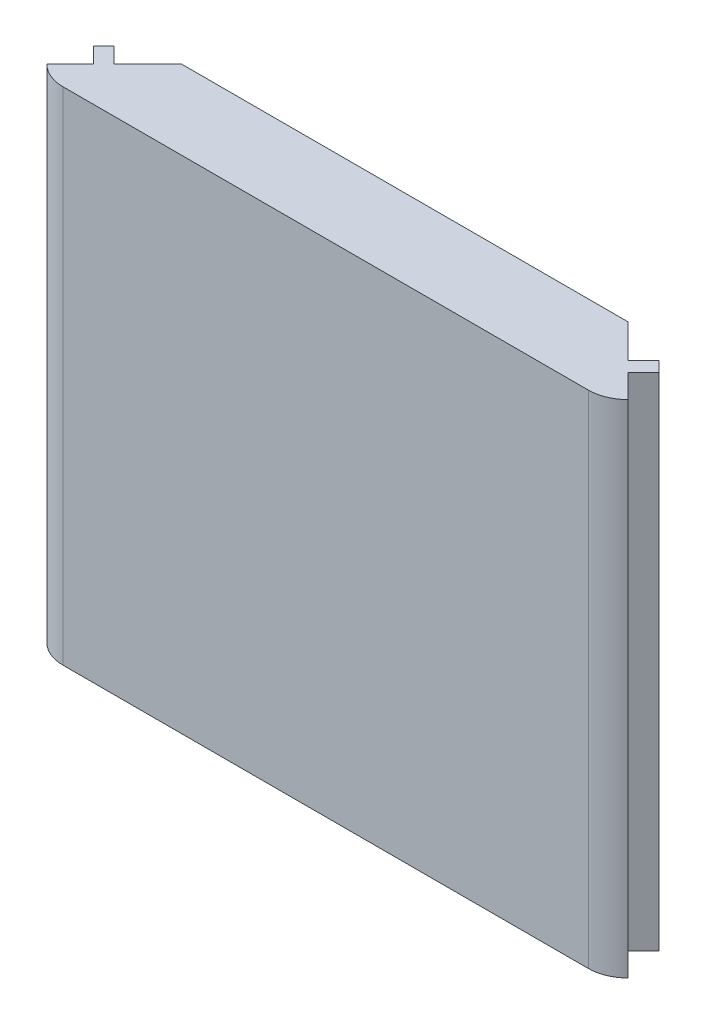
ISO-10303-21;
HEADER;
FILE_DESCRIPTION(('STEP AP214'),'2;1');
FILE_NAME('part.step','',(''),(''),'','','');
FILE_SCHEMA(('AUTOMOTIVE_DESIGN { 1 0 10303 214 1 1 1 1 }'));
ENDSEC;
DATA;
#1=APPLICATION_CONTEXT('core data for automotive mechanical design processes');
#2=APPLICATION_PROTOCOL_DEFINITION('international standard','automotive_design',2000,#1);
#3=PRODUCT_CONTEXT('',#1,'mechanical');
#4=PRODUCT('Part','Part','',(#3));
#5=PRODUCT_RELATED_PRODUCT_CATEGORY('part','',(#4));
#6=PRODUCT_DEFINITION_FORMATION('','',#4);
#7=PRODUCT_DEFINITION_CONTEXT('part definition',#1,'design');
#8=PRODUCT_DEFINITION('design','',#6,#7);
#9=PRODUCT_DEFINITION_SHAPE('','',#8);
#10=(LENGTH_UNIT() NAMED_UNIT(*) SI_UNIT(.MILLI.,.METRE.));
#11=(NAMED_UNIT(*) PLANE_ANGLE_UNIT() SI_UNIT($,.RADIAN.));
#12=(NAMED_UNIT(*) SI_UNIT($,.STERADIAN.) SOLID_ANGLE_UNIT());
#13=UNCERTAINTY_MEASURE_WITH_UNIT(LENGTH_MEASURE(1.E-05),#10,'distance_accuracy_value','');
#14=(GEOMETRIC_REPRESENTATION_CONTEXT(3) GLOBAL_UNCERTAINTY_ASSIGNED_CONTEXT((#13)) GLOBAL_UNIT_ASSIGNED_CONTEXT((#10,
#11,#12)) REPRESENTATION_CONTEXT('',''));
#15=CARTESIAN_POINT('',(0.,0.,0.));
#16=DIRECTION('',(0.,0.,1.));
#17=DIRECTION('',(1.,0.,0.));
#18=AXIS2_PLACEMENT_3D('',#15,#16,#17);
#19=CARTESIAN_POINT('',(40.95,-33.951,0.));
#20=DIRECTION('',(-0.707106781186547,0.,0.707106781186548));
#21=DIRECTION('',(0.707106781186548,0.,0.707106781186547));
#22=AXIS2_PLACEMENT_3D('',#19,#20,#21);
#23=PLANE('',#22);
#24=DIRECTION('',(0.,1.,0.));
#25=VECTOR('',#24,1.);
#26=CARTESIAN_POINT('',(34.8165106396737,-38.95,-6.13348936032626));
#27=LINE('',#26,#25);
#28=CARTESIAN_POINT('',(34.8165106396737,-33.95,-6.13348936032626));
#29=VERTEX_POINT('',#28);
#30=CARTESIAN_POINT('',(34.8165106396737,33.95,-6.13348936032626));
#31=VERTEX_POINT('',#30);
#32=EDGE_CURVE('E167',#29,#31,#27,.T.);
#33=ORIENTED_EDGE('',*,*,#32,.F.);
#34=DIRECTION('',(0.707106781186548,0.,0.707106781186547));
#35=VECTOR('',#34,1.);
#36=CARTESIAN_POINT('',(40.95,-33.95,0.));
#37=LINE('',#36,#35);
#38=CARTESIAN_POINT('',(30.25,-33.95,-10.7));
#39=VERTEX_POINT('',#38);
#40=EDGE_CURVE('E176',#39,#29,#37,.T.);
#41=ORIENTED_EDGE('',*,*,#40,.F.);
#42=DIRECTION('',(0.,1.,0.));
#43=VECTOR('',#42,1.);
#44=CARTESIAN_POINT('',(30.25,-33.951,-10.7));
#45=LINE('',#44,#43);
#46=CARTESIAN_POINT('',(30.25,-30.25,-10.7));
#47=VERTEX_POINT('',#46);
#48=EDGE_CURVE('E190',#39,#47,#45,.T.);
#49=ORIENTED_EDGE('',*,*,#48,.T.);
#50=DIRECTION('',(0.,-1.,0.));
#51=VECTOR('',#50,1.);
#52=CARTESIAN_POINT('',(30.25,30.25,-10.7));
#53=LINE('',#52,#51);
#54=CARTESIAN_POINT('',(30.25,30.25,-10.7));
#55=VERTEX_POINT('',#54);
#56=EDGE_CURVE('E236',#55,#47,#53,.T.);
#57=ORIENTED_EDGE('',*,*,#56,.F.);
#58=CARTESIAN_POINT('',(30.25,33.95,-10.7));
#59=VERTEX_POINT('',#58);
#60=EDGE_CURVE('E290',#55,#59,#45,.T.);
#61=ORIENTED_EDGE('',*,*,#60,.T.);
#62=DIRECTION('',(0.707106781186548,0.,0.707106781186548));
#63=VECTOR('',#62,1.);
#64=CARTESIAN_POINT('',(40.95,33.95,0.));
#65=LINE('',#64,#63);
#66=EDGE_CURVE('E179',#59,#31,#65,.T.);
#67=ORIENTED_EDGE('',*,*,#66,.T.);
#68=EDGE_LOOP('',(#33,#41,#49,#57,#61,#67));
#69=FACE_BOUND('',#68,.T.);
#70=ADVANCED_FACE('F35',(#69),#23,.F.);
#71=CARTESIAN_POINT('',(-40.95,-33.951,0.));
#72=DIRECTION('',(0.707106781186547,0.,0.707106781186548));
#73=DIRECTION('',(0.707106781186548,0.,-0.707106781186547));
#74=AXIS2_PLACEMENT_3D('',#71,#72,#73);
#75=PLANE('',#74);
#76=DIRECTION('',(0.,1.,0.));
#77=VECTOR('',#76,1.);
#78=CARTESIAN_POINT('',(-36.2307242020469,-38.95,-4.71927579795315));
#79=LINE('',#78,#77);
#80=CARTESIAN_POINT('',(-36.2307242020469,-33.95,-4.71927579795315));
#81=VERTEX_POINT('',#80);
#82=CARTESIAN_POINT('',(-36.2307242020469,33.95,-4.71927579795315));
#83=VERTEX_POINT('',#82);
#84=EDGE_CURVE('E317',#81,#83,#79,.T.);
#85=ORIENTED_EDGE('',*,*,#84,.F.);
#86=DIRECTION('',(0.707106781186548,0.,-0.707106781186547));
#87=VECTOR('',#86,1.);
#88=CARTESIAN_POINT('',(-40.95,-33.95,0.));
#89=LINE('',#88,#87);
#90=CARTESIAN_POINT('',(-39.3830212793475,-33.95,-1.56697872065252));
#91=VERTEX_POINT('',#90);
#92=EDGE_CURVE('E245',#91,#81,#89,.T.);
#93=ORIENTED_EDGE('',*,*,#92,.F.);
#94=DIRECTION('',(0.,-1.,0.));
#95=VECTOR('',#94,1.);
#96=CARTESIAN_POINT('',(-39.3830212793475,33.951,-1.56697872065252));
#97=LINE('',#96,#95);
#98=CARTESIAN_POINT('',(-39.3830212793475,33.95,-1.56697872065251));
#99=VERTEX_POINT('',#98);
#100=EDGE_CURVE('E308',#99,#91,#97,.T.);
#101=ORIENTED_EDGE('',*,*,#100,.F.);
#102=DIRECTION('',(0.707106781186548,0.,-0.707106781186548));
#103=VECTOR('',#102,1.);
#104=CARTESIAN_POINT('',(-40.95,33.95,0.));
#105=LINE('',#104,#103);
#106=EDGE_CURVE('E188',#99,#83,#105,.T.);
#107=ORIENTED_EDGE('',*,*,#106,.T.);
#108=EDGE_LOOP('',(#85,#93,#101,#107));
#109=FACE_BOUND('',#108,.T.);
#110=ADVANCED_FACE('F364',(#109),#75,.F.);
#111=CARTESIAN_POINT('',(-40.95,-33.95,-10.7));
#112=DIRECTION('',(0.,-1.,0.));
#113=DIRECTION('',(0.,0.,-1.));
#114=AXIS2_PLACEMENT_3D('',#111,#112,#113);
#115=PLANE('',#114);
#116=DIRECTION('',(1.,0.,0.));
#117=VECTOR('',#116,1.);
#118=CARTESIAN_POINT('',(-40.95,-33.95,0.));
#119=LINE('',#118,#117);
#120=CARTESIAN_POINT('',(-35.5999999999992,-33.95,0.));
#121=VERTEX_POINT('',#120);
#122=CARTESIAN_POINT('',(35.5999999999992,-33.95,0.));
#123=VERTEX_POINT('',#122);
#124=EDGE_CURVE('E212',#121,#123,#119,.T.);
#125=ORIENTED_EDGE('',*,*,#124,.F.);
#126=CARTESIAN_POINT('',(-35.5999999999992,-33.95,-5.34999999999922));
#127=DIRECTION('',(0.,-1.,0.));
#128=DIRECTION('',(0.,0.,-1.));
#129=AXIS2_PLACEMENT_3D('',#126,#127,#128);
#130=CIRCLE('',#129,5.34999999999921);
#131=EDGE_CURVE('E313',#121,#91,#130,.T.);
#132=ORIENTED_EDGE('',*,*,#131,.T.);
#133=ORIENTED_EDGE('',*,*,#92,.T.);
#134=DIRECTION('',(0.707106781186545,0.,0.70710678118655));
#135=VECTOR('',#134,1.);
#136=CARTESIAN_POINT('',(-36.2307242020469,-33.95,-4.71927579795315));
#137=LINE('',#136,#135);
#138=CARTESIAN_POINT('',(-38.3520445456065,-33.95,-6.84059614151279));
#139=VERTEX_POINT('',#138);
#140=EDGE_CURVE('E324',#139,#81,#137,.T.);
#141=ORIENTED_EDGE('',*,*,#140,.F.);
#142=DIRECTION('',(-0.707106781186547,0.,0.707106781186548));
#143=VECTOR('',#142,1.);
#144=CARTESIAN_POINT('',(-38.3520445456065,-33.95,-6.84059614151279));
#145=LINE('',#144,#143);
#146=CARTESIAN_POINT('',(-36.9378309832334,-33.95,-8.25480970388589));
#147=VERTEX_POINT('',#146);
#148=EDGE_CURVE('E346',#147,#139,#145,.T.);
#149=ORIENTED_EDGE('',*,*,#148,.F.);
#150=DIRECTION('',(-0.707106781186549,0.,-0.707106781186546));
#151=VECTOR('',#150,1.);
#152=CARTESIAN_POINT('',(-36.9378309832334,-33.95,-8.25480970388589));
#153=LINE('',#152,#151);
#154=CARTESIAN_POINT('',(-34.8165106396737,-33.95,-6.13348936032626));
#155=VERTEX_POINT('',#154);
#156=EDGE_CURVE('E351',#155,#147,#153,.T.);
#157=ORIENTED_EDGE('',*,*,#156,.F.);
#158=CARTESIAN_POINT('',(-30.25,-33.95,-10.7));
#159=VERTEX_POINT('',#158);
#160=EDGE_CURVE('E258',#155,#159,#89,.T.);
#161=ORIENTED_EDGE('',*,*,#160,.T.);
#162=DIRECTION('',(1.,0.,0.));
#163=VECTOR('',#162,1.);
#164=CARTESIAN_POINT('',(-40.95,-33.95,-10.7));
#165=LINE('',#164,#163);
#166=EDGE_CURVE('E11',#159,#39,#165,.T.);
#167=ORIENTED_EDGE('',*,*,#166,.T.);
#168=ORIENTED_EDGE('',*,*,#40,.T.);
#169=DIRECTION('',(-0.707106781186549,0.,0.707106781186546));
#170=VECTOR('',#169,1.);
#171=CARTESIAN_POINT('',(36.9378309832334,-33.95,-8.25480970388589));
#172=LINE('',#171,#170);
#173=CARTESIAN_POINT('',(36.9378309832334,-33.95,-8.25480970388589));
#174=VERTEX_POINT('',#173);
#175=EDGE_CURVE('E163',#174,#29,#172,.T.);
#176=ORIENTED_EDGE('',*,*,#175,.F.);
#177=DIRECTION('',(-0.707106781186547,0.,-0.707106781186548));
#178=VECTOR('',#177,1.);
#179=CARTESIAN_POINT('',(38.3520445456065,-33.95,-6.84059614151279));
#180=LINE('',#179,#178);
#181=CARTESIAN_POINT('',(38.3520445456065,-33.95,-6.84059614151279));
#182=VERTEX_POINT('',#181);
#183=EDGE_CURVE('E334',#182,#174,#180,.T.);
#184=ORIENTED_EDGE('',*,*,#183,.F.);
#185=DIRECTION('',(0.707106781186545,0.,-0.70710678118655));
#186=VECTOR('',#185,1.);
#187=CARTESIAN_POINT('',(36.2307242020469,-33.95,-4.71927579795314));
#188=LINE('',#187,#186);
#189=CARTESIAN_POINT('',(36.2307242020469,-33.95,-4.71927579795314));
#190=VERTEX_POINT('',#189);
#191=EDGE_CURVE('E379',#190,#182,#188,.T.);
#192=ORIENTED_EDGE('',*,*,#191,.F.);
#193=CARTESIAN_POINT('',(39.3830212793475,-33.95,-1.56697872065252));
#194=VERTEX_POINT('',#193);
#195=EDGE_CURVE('E186',#190,#194,#37,.T.);
#196=ORIENTED_EDGE('',*,*,#195,.T.);
#197=CARTESIAN_POINT('',(35.5999999999992,-33.95,-5.34999999999922));
#198=DIRECTION('',(0.,-1.,0.));
#199=DIRECTION('',(0.,0.,1.));
#200=AXIS2_PLACEMENT_3D('',#197,#198,#199);
#201=CIRCLE('',#200,5.34999999999921);
#202=EDGE_CURVE('E303',#194,#123,#201,.T.);
#203=ORIENTED_EDGE('',*,*,#202,.T.);
#204=EDGE_LOOP('',(#125,#132,#133,#141,#149,#157,#161,#167,#168,#176,#184,#192,#196,#203));
#205=FACE_BOUND('',#204,.T.);
#206=ADVANCED_FACE('F183',(#205),#115,.T.);
#207=CARTESIAN_POINT('',(-40.95,33.95,-10.7));
#208=DIRECTION('',(0.,1.,0.));
#209=DIRECTION('',(0.,0.,1.));
#210=AXIS2_PLACEMENT_3D('',#207,#208,#209);
#211=PLANE('',#210);
#212=ORIENTED_EDGE('',*,*,#106,.F.);
#213=CARTESIAN_POINT('',(-35.5999999999992,33.95,-5.34999999999922));
#214=DIRECTION('',(0.,1.,0.));
#215=DIRECTION('',(0.,0.,1.));
#216=AXIS2_PLACEMENT_3D('',#213,#214,#215);
#217=CIRCLE('',#216,5.34999999999921);
#218=CARTESIAN_POINT('',(-35.5999999999992,33.95,0.));
#219=VERTEX_POINT('',#218);
#220=EDGE_CURVE('E315',#219,#99,#217,.F.);
#221=ORIENTED_EDGE('',*,*,#220,.F.);
#222=DIRECTION('',(-1.,0.,0.));
#223=VECTOR('',#222,1.);
#224=CARTESIAN_POINT('',(-40.95,33.95,0.));
#225=LINE('',#224,#223);
#226=CARTESIAN_POINT('',(35.5999999999992,33.95,0.));
#227=VERTEX_POINT('',#226);
#228=EDGE_CURVE('E214',#227,#219,#225,.T.);
#229=ORIENTED_EDGE('',*,*,#228,.F.);
#230=CARTESIAN_POINT('',(35.5999999999992,33.95,-5.34999999999922));
#231=DIRECTION('',(0.,1.,0.));
#232=DIRECTION('',(0.,0.,1.));
#233=AXIS2_PLACEMENT_3D('',#230,#231,#232);
#234=CIRCLE('',#233,5.34999999999921);
#235=CARTESIAN_POINT('',(39.3830212793475,33.95,-1.56697872065251));
#236=VERTEX_POINT('',#235);
#237=EDGE_CURVE('E306',#236,#227,#234,.F.);
#238=ORIENTED_EDGE('',*,*,#237,.F.);
#239=CARTESIAN_POINT('',(36.2307242020469,33.95,-4.71927579795314));
#240=VERTEX_POINT('',#239);
#241=EDGE_CURVE('E291',#240,#236,#65,.T.);
#242=ORIENTED_EDGE('',*,*,#241,.F.);
#243=DIRECTION('',(0.707106781186545,0.,-0.70710678118655));
#244=VECTOR('',#243,1.);
#245=CARTESIAN_POINT('',(36.2307242020469,33.95,-4.71927579795314));
#246=LINE('',#245,#244);
#247=CARTESIAN_POINT('',(38.3520445456065,33.95,-6.84059614151279));
#248=VERTEX_POINT('',#247);
#249=EDGE_CURVE('E52',#240,#248,#246,.T.);
#250=ORIENTED_EDGE('',*,*,#249,.T.);
#251=DIRECTION('',(-0.707106781186547,0.,-0.707106781186548));
#252=VECTOR('',#251,1.);
#253=CARTESIAN_POINT('',(38.3520445456065,33.95,-6.84059614151279));
#254=LINE('',#253,#252);
#255=CARTESIAN_POINT('',(36.9378309832334,33.95,-8.25480970388589));
#256=VERTEX_POINT('',#255);
#257=EDGE_CURVE('E384',#248,#256,#254,.T.);
#258=ORIENTED_EDGE('',*,*,#257,.T.);
#259=DIRECTION('',(-0.707106781186549,0.,0.707106781186546));
#260=VECTOR('',#259,1.);
#261=CARTESIAN_POINT('',(36.9378309832334,33.95,-8.25480970388589));
#262=LINE('',#261,#260);
#263=EDGE_CURVE('E385',#256,#31,#262,.T.);
#264=ORIENTED_EDGE('',*,*,#263,.T.);
#265=ORIENTED_EDGE('',*,*,#66,.F.);
#266=DIRECTION('',(-1.,0.,0.));
#267=VECTOR('',#266,1.);
#268=CARTESIAN_POINT('',(-40.95,33.95,-10.7));
#269=LINE('',#268,#267);
#270=CARTESIAN_POINT('',(-30.25,33.95,-10.7));
#271=VERTEX_POINT('',#270);
#272=EDGE_CURVE('E44',#59,#271,#269,.T.);
#273=ORIENTED_EDGE('',*,*,#272,.T.);
#274=CARTESIAN_POINT('',(-34.8165106396737,33.95,-6.13348936032626));
#275=VERTEX_POINT('',#274);
#276=EDGE_CURVE('E185',#275,#271,#105,.T.);
#277=ORIENTED_EDGE('',*,*,#276,.F.);
#278=DIRECTION('',(-0.707106781186549,0.,-0.707106781186546));
#279=VECTOR('',#278,1.);
#280=CARTESIAN_POINT('',(-36.9378309832334,33.95,-8.25480970388589));
#281=LINE('',#280,#279);
#282=CARTESIAN_POINT('',(-36.9378309832334,33.95,-8.25480970388589));
#283=VERTEX_POINT('',#282);
#284=EDGE_CURVE('E60',#275,#283,#281,.T.);
#285=ORIENTED_EDGE('',*,*,#284,.T.);
#286=DIRECTION('',(-0.707106781186547,0.,0.707106781186548));
#287=VECTOR('',#286,1.);
#288=CARTESIAN_POINT('',(-38.3520445456065,33.95,-6.84059614151279));
#289=LINE('',#288,#287);
#290=CARTESIAN_POINT('',(-38.3520445456065,33.95,-6.84059614151279));
#291=VERTEX_POINT('',#290);
#292=EDGE_CURVE('E333',#283,#291,#289,.T.);
#293=ORIENTED_EDGE('',*,*,#292,.T.);
#294=DIRECTION('',(0.707106781186545,0.,0.70710678118655));
#295=VECTOR('',#294,1.);
#296=CARTESIAN_POINT('',(-36.2307242020469,33.95,-4.71927579795315));
#297=LINE('',#296,#295);
#298=EDGE_CURVE('E327',#291,#83,#297,.T.);
#299=ORIENTED_EDGE('',*,*,#298,.T.);
#300=EDGE_LOOP('',(#212,#221,#229,#238,#242,#250,#258,#264,#265,#273,#277,#285,#293,#299));
#301=FACE_BOUND('',#300,.T.);
#302=ADVANCED_FACE('F37',(#301),#211,.T.);
#303=CARTESIAN_POINT('',(0.,0.,0.));
#304=DIRECTION('',(0.,0.,1.));
#305=DIRECTION('',(1.,0.,0.));
#306=AXIS2_PLACEMENT_3D('',#303,#304,#305);
#307=PLANE('',#306);
#308=ORIENTED_EDGE('',*,*,#228,.T.);
#309=DIRECTION('',(0.,-1.,0.));
#310=VECTOR('',#309,1.);
#311=CARTESIAN_POINT('',(-35.5999999999992,33.951,0.));
#312=LINE('',#311,#310);
#313=EDGE_CURVE('E310',#219,#121,#312,.T.);
#314=ORIENTED_EDGE('',*,*,#313,.T.);
#315=ORIENTED_EDGE('',*,*,#124,.T.);
#316=DIRECTION('',(0.,-1.,0.));
#317=VECTOR('',#316,1.);
#318=CARTESIAN_POINT('',(35.5999999999992,33.951,0.));
#319=LINE('',#318,#317);
#320=EDGE_CURVE('E292',#227,#123,#319,.T.);
#321=ORIENTED_EDGE('',*,*,#320,.F.);
#322=EDGE_LOOP('',(#308,#314,#315,#321));
#323=FACE_BOUND('',#322,.T.);
#324=ADVANCED_FACE('F372',(#323),#307,.T.);
#325=ORIENTED_EDGE('',*,*,#160,.F.);
#326=DIRECTION('',(0.,1.,0.));
#327=VECTOR('',#326,1.);
#328=CARTESIAN_POINT('',(-34.8165106396737,-38.95,-6.13348936032626));
#329=LINE('',#328,#327);
#330=EDGE_CURVE('E345',#155,#275,#329,.T.);
#331=ORIENTED_EDGE('',*,*,#330,.T.);
#332=ORIENTED_EDGE('',*,*,#276,.T.);
#333=DIRECTION('',(0.,1.,0.));
#334=VECTOR('',#333,1.);
#335=CARTESIAN_POINT('',(-30.25,-33.951,-10.7));
#336=LINE('',#335,#334);
#337=CARTESIAN_POINT('',(-30.25,30.25,-10.7));
#338=VERTEX_POINT('',#337);
#339=EDGE_CURVE('E211',#338,#271,#336,.T.);
#340=ORIENTED_EDGE('',*,*,#339,.F.);
#341=DIRECTION('',(0.,1.,0.));
#342=VECTOR('',#341,1.);
#343=CARTESIAN_POINT('',(-30.25,30.25,-10.7));
#344=LINE('',#343,#342);
#345=CARTESIAN_POINT('',(-30.25,-30.25,-10.7));
#346=VERTEX_POINT('',#345);
#347=EDGE_CURVE('E242',#346,#338,#344,.T.);
#348=ORIENTED_EDGE('',*,*,#347,.F.);
#349=EDGE_CURVE('E204',#159,#346,#336,.T.);
#350=ORIENTED_EDGE('',*,*,#349,.F.);
#351=EDGE_LOOP('',(#325,#331,#332,#340,#348,#350));
#352=FACE_BOUND('',#351,.T.);
#353=ADVANCED_FACE('F275',(#352),#75,.F.);
#354=ORIENTED_EDGE('',*,*,#195,.F.);
#355=DIRECTION('',(0.,1.,0.));
#356=VECTOR('',#355,1.);
#357=CARTESIAN_POINT('',(36.2307242020469,-38.95,-4.71927579795314));
#358=LINE('',#357,#356);
#359=EDGE_CURVE('E180',#190,#240,#358,.T.);
#360=ORIENTED_EDGE('',*,*,#359,.T.);
#361=ORIENTED_EDGE('',*,*,#241,.T.);
#362=DIRECTION('',(0.,-1.,0.));
#363=VECTOR('',#362,1.);
#364=CARTESIAN_POINT('',(39.3830212793475,33.951,-1.56697872065252));
#365=LINE('',#364,#363);
#366=EDGE_CURVE('E300',#236,#194,#365,.T.);
#367=ORIENTED_EDGE('',*,*,#366,.T.);
#368=EDGE_LOOP('',(#354,#360,#361,#367));
#369=FACE_BOUND('',#368,.T.);
#370=ADVANCED_FACE('F381',(#369),#23,.F.);
#371=CARTESIAN_POINT('',(0.,0.,-10.7));
#372=DIRECTION('',(0.,0.,1.));
#373=DIRECTION('',(1.,0.,0.));
#374=AXIS2_PLACEMENT_3D('',#371,#372,#373);
#375=PLANE('',#374);
#376=ORIENTED_EDGE('',*,*,#272,.F.);
#377=ORIENTED_EDGE('',*,*,#60,.F.);
#378=DIRECTION('',(1.,0.,0.));
#379=VECTOR('',#378,1.);
#380=CARTESIAN_POINT('',(30.25,30.25,-10.7));
#381=LINE('',#380,#379);
#382=EDGE_CURVE('E239',#338,#55,#381,.T.);
#383=ORIENTED_EDGE('',*,*,#382,.F.);
#384=ORIENTED_EDGE('',*,*,#339,.T.);
#385=EDGE_LOOP('',(#376,#377,#383,#384));
#386=FACE_BOUND('',#385,.T.);
#387=ADVANCED_FACE('F272',(#386),#375,.F.);
#388=DIRECTION('',(-1.,0.,0.));
#389=VECTOR('',#388,1.);
#390=CARTESIAN_POINT('',(30.25,-30.25,-10.7));
#391=LINE('',#390,#389);
#392=EDGE_CURVE('E232',#47,#346,#391,.T.);
#393=ORIENTED_EDGE('',*,*,#392,.F.);
#394=ORIENTED_EDGE('',*,*,#48,.F.);
#395=ORIENTED_EDGE('',*,*,#166,.F.);
#396=ORIENTED_EDGE('',*,*,#349,.T.);
#397=EDGE_LOOP('',(#393,#394,#395,#396));
#398=FACE_BOUND('',#397,.T.);
#399=ADVANCED_FACE('F289',(#398),#375,.F.);
#400=CARTESIAN_POINT('',(-30.25,30.25,-1.5));
#401=DIRECTION('',(-1.,0.,0.));
#402=DIRECTION('',(0.,-1.,0.));
#403=AXIS2_PLACEMENT_3D('',#400,#401,#402);
#404=PLANE('',#403);
#405=ORIENTED_EDGE('',*,*,#347,.T.);
#406=DIRECTION('',(0.,0.,-1.));
#407=VECTOR('',#406,1.);
#408=CARTESIAN_POINT('',(-30.25,30.25,-1.5));
#409=LINE('',#408,#407);
#410=CARTESIAN_POINT('',(-30.25,30.25,-1.5));
#411=VERTEX_POINT('',#410);
#412=EDGE_CURVE('E220',#411,#338,#409,.T.);
#413=ORIENTED_EDGE('',*,*,#412,.F.);
#414=DIRECTION('',(0.,1.,0.));
#415=VECTOR('',#414,1.);
#416=CARTESIAN_POINT('',(-30.25,30.25,-1.5));
#417=LINE('',#416,#415);
#418=CARTESIAN_POINT('',(-30.25,-30.25,-1.5));
#419=VERTEX_POINT('',#418);
#420=EDGE_CURVE('E235',#419,#411,#417,.T.);
#421=ORIENTED_EDGE('',*,*,#420,.F.);
#422=DIRECTION('',(0.,0.,-1.));
#423=VECTOR('',#422,1.);
#424=CARTESIAN_POINT('',(-30.25,-30.25,-1.5));
#425=LINE('',#424,#423);
#426=EDGE_CURVE('E216',#419,#346,#425,.T.);
#427=ORIENTED_EDGE('',*,*,#426,.T.);
#428=EDGE_LOOP('',(#405,#413,#421,#427));
#429=FACE_BOUND('',#428,.T.);
#430=ADVANCED_FACE('F278',(#429),#404,.F.);
#431=CARTESIAN_POINT('',(30.25,-30.25,-1.5));
#432=DIRECTION('',(0.,-1.,0.));
#433=DIRECTION('',(0.,0.,-1.));
#434=AXIS2_PLACEMENT_3D('',#431,#432,#433);
#435=PLANE('',#434);
#436=ORIENTED_EDGE('',*,*,#392,.T.);
#437=ORIENTED_EDGE('',*,*,#426,.F.);
#438=DIRECTION('',(-1.,0.,0.));
#439=VECTOR('',#438,1.);
#440=CARTESIAN_POINT('',(30.25,-30.25,-1.5));
#441=LINE('',#440,#439);
#442=CARTESIAN_POINT('',(30.25,-30.25,-1.5));
#443=VERTEX_POINT('',#442);
#444=EDGE_CURVE('E224',#443,#419,#441,.T.);
#445=ORIENTED_EDGE('',*,*,#444,.F.);
#446=DIRECTION('',(0.,0.,-1.));
#447=VECTOR('',#446,1.);
#448=CARTESIAN_POINT('',(30.25,-30.25,-1.5));
#449=LINE('',#448,#447);
#450=EDGE_CURVE('E227',#443,#47,#449,.T.);
#451=ORIENTED_EDGE('',*,*,#450,.T.);
#452=EDGE_LOOP('',(#436,#437,#445,#451));
#453=FACE_BOUND('',#452,.T.);
#454=ADVANCED_FACE('F288',(#453),#435,.F.);
#455=CARTESIAN_POINT('',(30.25,30.25,-1.5));
#456=DIRECTION('',(1.,0.,0.));
#457=DIRECTION('',(0.,1.,0.));
#458=AXIS2_PLACEMENT_3D('',#455,#456,#457);
#459=PLANE('',#458);
#460=ORIENTED_EDGE('',*,*,#56,.T.);
#461=ORIENTED_EDGE('',*,*,#450,.F.);
#462=DIRECTION('',(0.,-1.,0.));
#463=VECTOR('',#462,1.);
#464=CARTESIAN_POINT('',(30.25,30.25,-1.5));
#465=LINE('',#464,#463);
#466=CARTESIAN_POINT('',(30.25,30.25,-1.5));
#467=VERTEX_POINT('',#466);
#468=EDGE_CURVE('E248',#467,#443,#465,.T.);
#469=ORIENTED_EDGE('',*,*,#468,.F.);
#470=DIRECTION('',(0.,0.,-1.));
#471=VECTOR('',#470,1.);
#472=CARTESIAN_POINT('',(30.25,30.25,-1.5));
#473=LINE('',#472,#471);
#474=EDGE_CURVE('E223',#467,#55,#473,.T.);
#475=ORIENTED_EDGE('',*,*,#474,.T.);
#476=EDGE_LOOP('',(#460,#461,#469,#475));
#477=FACE_BOUND('',#476,.T.);
#478=ADVANCED_FACE('F427',(#477),#459,.F.);
#479=CARTESIAN_POINT('',(30.25,30.25,-1.5));
#480=DIRECTION('',(0.,1.,0.));
#481=DIRECTION('',(0.,0.,1.));
#482=AXIS2_PLACEMENT_3D('',#479,#480,#481);
#483=PLANE('',#482);
#484=ORIENTED_EDGE('',*,*,#382,.T.);
#485=ORIENTED_EDGE('',*,*,#474,.F.);
#486=DIRECTION('',(1.,0.,0.));
#487=VECTOR('',#486,1.);
#488=CARTESIAN_POINT('',(30.25,30.25,-1.5));
#489=LINE('',#488,#487);
#490=EDGE_CURVE('E251',#411,#467,#489,.T.);
#491=ORIENTED_EDGE('',*,*,#490,.F.);
#492=ORIENTED_EDGE('',*,*,#412,.T.);
#493=EDGE_LOOP('',(#484,#485,#491,#492));
#494=FACE_BOUND('',#493,.T.);
#495=ADVANCED_FACE('F282',(#494),#483,.F.);
#496=CARTESIAN_POINT('',(0.,0.,-1.5));
#497=DIRECTION('',(0.,0.,-1.));
#498=DIRECTION('',(-1.,0.,0.));
#499=AXIS2_PLACEMENT_3D('',#496,#497,#498);
#500=PLANE('',#499);
#501=ORIENTED_EDGE('',*,*,#420,.T.);
#502=ORIENTED_EDGE('',*,*,#490,.T.);
#503=ORIENTED_EDGE('',*,*,#468,.T.);
#504=ORIENTED_EDGE('',*,*,#444,.T.);
#505=EDGE_LOOP('',(#501,#502,#503,#504));
#506=FACE_BOUND('',#505,.T.);
#507=ADVANCED_FACE('F285',(#506),#500,.T.);
#508=CARTESIAN_POINT('',(35.5999999999992,33.951,-5.34999999999922));
#509=DIRECTION('',(0.,-1.,0.));
#510=DIRECTION('',(0.,0.,-1.));
#511=AXIS2_PLACEMENT_3D('',#508,#509,#510);
#512=CYLINDRICAL_SURFACE('',#511,5.34999999999921);
#513=ORIENTED_EDGE('',*,*,#237,.T.);
#514=ORIENTED_EDGE('',*,*,#320,.T.);
#515=ORIENTED_EDGE('',*,*,#202,.F.);
#516=ORIENTED_EDGE('',*,*,#366,.F.);
#517=EDGE_LOOP('',(#513,#514,#515,#516));
#518=FACE_BOUND('',#517,.T.);
#519=ADVANCED_FACE('F375',(#518),#512,.T.);
#520=CARTESIAN_POINT('',(-35.5999999999992,33.951,-5.34999999999922));
#521=DIRECTION('',(0.,-1.,0.));
#522=DIRECTION('',(0.,0.,-1.));
#523=AXIS2_PLACEMENT_3D('',#520,#521,#522);
#524=CYLINDRICAL_SURFACE('',#523,5.34999999999921);
#525=ORIENTED_EDGE('',*,*,#220,.T.);
#526=ORIENTED_EDGE('',*,*,#100,.T.);
#527=ORIENTED_EDGE('',*,*,#131,.F.);
#528=ORIENTED_EDGE('',*,*,#313,.F.);
#529=EDGE_LOOP('',(#525,#526,#527,#528));
#530=FACE_BOUND('',#529,.T.);
#531=ADVANCED_FACE('F460',(#530),#524,.T.);
#532=CARTESIAN_POINT('',(-36.9378309832334,-38.95,-8.25480970388589));
#533=DIRECTION('',(0.707106781186546,0.,-0.707106781186549));
#534=DIRECTION('',(-0.707106781186549,0.,-0.707106781186546));
#535=AXIS2_PLACEMENT_3D('',#532,#533,#534);
#536=PLANE('',#535);
#537=ORIENTED_EDGE('',*,*,#330,.F.);
#538=ORIENTED_EDGE('',*,*,#156,.T.);
#539=DIRECTION('',(0.,1.,0.));
#540=VECTOR('',#539,1.);
#541=CARTESIAN_POINT('',(-36.9378309832334,-38.95,-8.25480970388589));
#542=LINE('',#541,#540);
#543=EDGE_CURVE('E350',#147,#283,#542,.T.);
#544=ORIENTED_EDGE('',*,*,#543,.T.);
#545=ORIENTED_EDGE('',*,*,#284,.F.);
#546=EDGE_LOOP('',(#537,#538,#544,#545));
#547=FACE_BOUND('',#546,.T.);
#548=ADVANCED_FACE('F468',(#547),#536,.T.);
#549=CARTESIAN_POINT('',(-38.3520445456065,-38.95,-6.84059614151279));
#550=DIRECTION('',(-0.707106781186548,0.,-0.707106781186547));
#551=DIRECTION('',(-0.707106781186547,0.,0.707106781186548));
#552=AXIS2_PLACEMENT_3D('',#549,#550,#551);
#553=PLANE('',#552);
#554=ORIENTED_EDGE('',*,*,#543,.F.);
#555=ORIENTED_EDGE('',*,*,#148,.T.);
#556=DIRECTION('',(0.,1.,0.));
#557=VECTOR('',#556,1.);
#558=CARTESIAN_POINT('',(-38.3520445456065,-38.95,-6.84059614151279));
#559=LINE('',#558,#557);
#560=EDGE_CURVE('E349',#139,#291,#559,.T.);
#561=ORIENTED_EDGE('',*,*,#560,.T.);
#562=ORIENTED_EDGE('',*,*,#292,.F.);
#563=EDGE_LOOP('',(#554,#555,#561,#562));
#564=FACE_BOUND('',#563,.T.);
#565=ADVANCED_FACE('F503',(#564),#553,.T.);
#566=CARTESIAN_POINT('',(-36.2307242020469,-38.95,-4.71927579795315));
#567=DIRECTION('',(-0.70710678118655,0.,0.707106781186545));
#568=DIRECTION('',(0.707106781186545,0.,0.70710678118655));
#569=AXIS2_PLACEMENT_3D('',#566,#567,#568);
#570=PLANE('',#569);
#571=ORIENTED_EDGE('',*,*,#560,.F.);
#572=ORIENTED_EDGE('',*,*,#140,.T.);
#573=ORIENTED_EDGE('',*,*,#84,.T.);
#574=ORIENTED_EDGE('',*,*,#298,.F.);
#575=EDGE_LOOP('',(#571,#572,#573,#574));
#576=FACE_BOUND('',#575,.T.);
#577=ADVANCED_FACE('F362',(#576),#570,.T.);
#578=CARTESIAN_POINT('',(36.9378309832334,-38.95,-8.25480970388589));
#579=DIRECTION('',(-0.707106781186546,0.,-0.707106781186549));
#580=DIRECTION('',(-0.707106781186549,0.,0.707106781186546));
#581=AXIS2_PLACEMENT_3D('',#578,#579,#580);
#582=PLANE('',#581);
#583=DIRECTION('',(0.,1.,0.));
#584=VECTOR('',#583,1.);
#585=CARTESIAN_POINT('',(36.9378309832334,-38.95,-8.25480970388589));
#586=LINE('',#585,#584);
#587=EDGE_CURVE('E169',#174,#256,#586,.T.);
#588=ORIENTED_EDGE('',*,*,#587,.F.);
#589=ORIENTED_EDGE('',*,*,#175,.T.);
#590=ORIENTED_EDGE('',*,*,#32,.T.);
#591=ORIENTED_EDGE('',*,*,#263,.F.);
#592=EDGE_LOOP('',(#588,#589,#590,#591));
#593=FACE_BOUND('',#592,.T.);
#594=ADVANCED_FACE('F165',(#593),#582,.T.);
#595=CARTESIAN_POINT('',(36.2307242020469,-38.95,-4.71927579795314));
#596=DIRECTION('',(0.70710678118655,0.,0.707106781186545));
#597=DIRECTION('',(0.707106781186545,0.,-0.70710678118655));
#598=AXIS2_PLACEMENT_3D('',#595,#596,#597);
#599=PLANE('',#598);
#600=ORIENTED_EDGE('',*,*,#359,.F.);
#601=ORIENTED_EDGE('',*,*,#191,.T.);
#602=DIRECTION('',(0.,1.,0.));
#603=VECTOR('',#602,1.);
#604=CARTESIAN_POINT('',(38.3520445456065,-38.95,-6.84059614151279));
#605=LINE('',#604,#603);
#606=EDGE_CURVE('E338',#182,#248,#605,.T.);
#607=ORIENTED_EDGE('',*,*,#606,.T.);
#608=ORIENTED_EDGE('',*,*,#249,.F.);
#609=EDGE_LOOP('',(#600,#601,#607,#608));
#610=FACE_BOUND('',#609,.T.);
#611=ADVANCED_FACE('F395',(#610),#599,.T.);
#612=CARTESIAN_POINT('',(38.3520445456065,-38.95,-6.84059614151279));
#613=DIRECTION('',(0.707106781186548,0.,-0.707106781186547));
#614=DIRECTION('',(-0.707106781186547,0.,-0.707106781186548));
#615=AXIS2_PLACEMENT_3D('',#612,#613,#614);
#616=PLANE('',#615);
#617=ORIENTED_EDGE('',*,*,#606,.F.);
#618=ORIENTED_EDGE('',*,*,#183,.T.);
#619=ORIENTED_EDGE('',*,*,#587,.T.);
#620=ORIENTED_EDGE('',*,*,#257,.F.);
#621=EDGE_LOOP('',(#617,#618,#619,#620));
#622=FACE_BOUND('',#621,.T.);
#623=ADVANCED_FACE('F397',(#622),#616,.T.);
#624=CLOSED_SHELL('',(#70,#110,#206,#302,#324,#353,#370,#387,#399,#430,#454,#478,#495,#507,#519,
#531,#548,#565,#577,#594,#611,#623));
#625=MANIFOLD_SOLID_BREP('B2',#624);
#626=ADVANCED_BREP_SHAPE_REPRESENTATION('',(#18,#625),#14);
#627=SHAPE_DEFINITION_REPRESENTATION(#9,#626);
ENDSEC;
END-ISO-10303-21;
